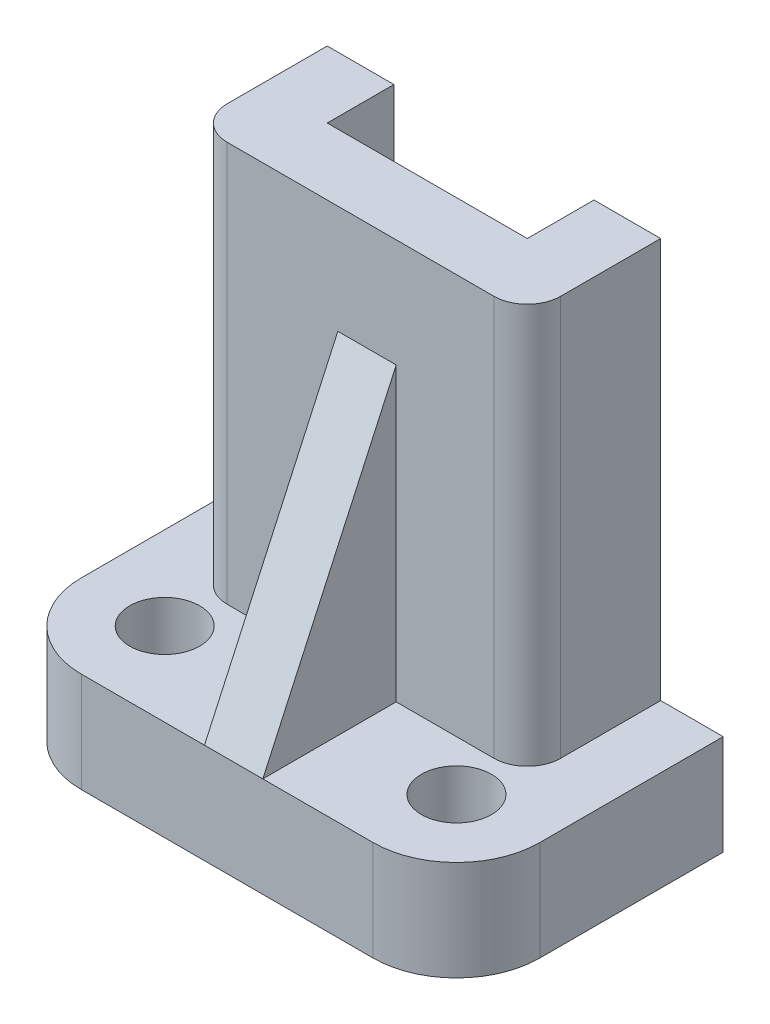
ISO-10303-21;
HEADER;
FILE_DESCRIPTION(('STEP AP214'),'2;1');
FILE_NAME('part.step','',(''),(''),'','','');
FILE_SCHEMA(('AUTOMOTIVE_DESIGN { 1 0 10303 214 1 1 1 1 }'));
ENDSEC;
DATA;
#1=APPLICATION_CONTEXT('core data for automotive mechanical design processes');
#2=APPLICATION_PROTOCOL_DEFINITION('international standard','automotive_design',2000,#1);
#3=PRODUCT_CONTEXT('',#1,'mechanical');
#4=PRODUCT('Part','Part','',(#3));
#5=PRODUCT_RELATED_PRODUCT_CATEGORY('part','',(#4));
#6=PRODUCT_DEFINITION_FORMATION('','',#4);
#7=PRODUCT_DEFINITION_CONTEXT('part definition',#1,'design');
#8=PRODUCT_DEFINITION('design','',#6,#7);
#9=PRODUCT_DEFINITION_SHAPE('','',#8);
#10=(LENGTH_UNIT() NAMED_UNIT(*) SI_UNIT(.MILLI.,.METRE.));
#11=(NAMED_UNIT(*) PLANE_ANGLE_UNIT() SI_UNIT($,.RADIAN.));
#12=(NAMED_UNIT(*) SI_UNIT($,.STERADIAN.) SOLID_ANGLE_UNIT());
#13=UNCERTAINTY_MEASURE_WITH_UNIT(LENGTH_MEASURE(1.E-05),#10,'distance_accuracy_value','');
#14=(GEOMETRIC_REPRESENTATION_CONTEXT(3) GLOBAL_UNCERTAINTY_ASSIGNED_CONTEXT((#13)) GLOBAL_UNIT_ASSIGNED_CONTEXT((#10,
#11,#12)) REPRESENTATION_CONTEXT('',''));
#15=CARTESIAN_POINT('',(0.,0.,0.));
#16=DIRECTION('',(0.,0.,1.));
#17=DIRECTION('',(1.,0.,0.));
#18=AXIS2_PLACEMENT_3D('',#15,#16,#17);
#19=CARTESIAN_POINT('',(0.,0.,16.));
#20=DIRECTION('',(0.,0.,1.));
#21=DIRECTION('',(1.,0.,0.));
#22=AXIS2_PLACEMENT_3D('',#19,#20,#21);
#23=PLANE('',#22);
#24=DIRECTION('',(0.,-1.,0.));
#25=VECTOR('',#24,1.);
#26=CARTESIAN_POINT('',(-22.7276368491322,35.,16.));
#27=LINE('',#26,#25);
#28=CARTESIAN_POINT('',(-22.7276368491322,35.,16.));
#29=VERTEX_POINT('',#28);
#30=CARTESIAN_POINT('',(-22.7276368491322,0.,16.));
#31=VERTEX_POINT('',#30);
#32=EDGE_CURVE('E421',#29,#31,#27,.T.);
#33=ORIENTED_EDGE('',*,*,#32,.F.);
#34=DIRECTION('',(-1.,0.,0.));
#35=VECTOR('',#34,1.);
#36=CARTESIAN_POINT('',(-15.7276368491322,35.,16.));
#37=LINE('',#36,#35);
#38=CARTESIAN_POINT('',(-15.7276368491322,35.,16.));
#39=VERTEX_POINT('',#38);
#40=EDGE_CURVE('E201',#39,#29,#37,.T.);
#41=ORIENTED_EDGE('',*,*,#40,.F.);
#42=DIRECTION('',(0.,1.,0.));
#43=VECTOR('',#42,1.);
#44=CARTESIAN_POINT('',(-15.7276368491322,35.,16.));
#45=LINE('',#44,#43);
#46=CARTESIAN_POINT('',(-15.7276368491322,0.,16.));
#47=VERTEX_POINT('',#46);
#48=EDGE_CURVE('E190',#47,#39,#45,.T.);
#49=ORIENTED_EDGE('',*,*,#48,.F.);
#50=DIRECTION('',(1.,0.,0.));
#51=VECTOR('',#50,1.);
#52=CARTESIAN_POINT('',(0.,0.,16.));
#53=LINE('',#52,#51);
#54=CARTESIAN_POINT('',(-4.,0.,16.));
#55=VERTEX_POINT('',#54);
#56=EDGE_CURVE('E199',#47,#55,#53,.T.);
#57=ORIENTED_EDGE('',*,*,#56,.T.);
#58=DIRECTION('',(0.,1.,0.));
#59=VECTOR('',#58,1.);
#60=CARTESIAN_POINT('',(-4.,48.,16.));
#61=LINE('',#60,#59);
#62=CARTESIAN_POINT('',(-4.,48.,16.));
#63=VERTEX_POINT('',#62);
#64=EDGE_CURVE('E272',#55,#63,#61,.T.);
#65=ORIENTED_EDGE('',*,*,#64,.T.);
#66=DIRECTION('',(-1.,0.,0.));
#67=VECTOR('',#66,1.);
#68=CARTESIAN_POINT('',(0.,48.,16.));
#69=LINE('',#68,#67);
#70=CARTESIAN_POINT('',(-36.,48.,16.));
#71=VERTEX_POINT('',#70);
#72=EDGE_CURVE('E248',#63,#71,#69,.T.);
#73=ORIENTED_EDGE('',*,*,#72,.T.);
#74=DIRECTION('',(0.,-1.,0.));
#75=VECTOR('',#74,1.);
#76=CARTESIAN_POINT('',(-36.,0.,16.));
#77=LINE('',#76,#75);
#78=CARTESIAN_POINT('',(-36.,0.,16.));
#79=VERTEX_POINT('',#78);
#80=EDGE_CURVE('E275',#71,#79,#77,.T.);
#81=ORIENTED_EDGE('',*,*,#80,.T.);
#82=EDGE_CURVE('E252',#79,#31,#53,.T.);
#83=ORIENTED_EDGE('',*,*,#82,.T.);
#84=EDGE_LOOP('',(#33,#41,#49,#57,#65,#73,#81,#83));
#85=FACE_BOUND('',#84,.T.);
#86=ADVANCED_FACE('F39',(#85),#23,.T.);
#87=CARTESIAN_POINT('',(0.,0.,0.));
#88=DIRECTION('',(0.,-1.,0.));
#89=DIRECTION('',(1.,0.,0.));
#90=AXIS2_PLACEMENT_3D('',#87,#88,#89);
#91=PLANE('',#90);
#92=CARTESIAN_POINT('',(-37.5,0.,22.));
#93=DIRECTION('',(0.,-1.,0.));
#94=DIRECTION('',(1.,0.,0.));
#95=AXIS2_PLACEMENT_3D('',#92,#93,#94);
#96=CIRCLE('',#95,4.2);
#97=CARTESIAN_POINT('',(-33.3,0.,22.));
#98=VERTEX_POINT('',#97);
#99=EDGE_CURVE('E43',#98,#98,#96,.T.);
#100=ORIENTED_EDGE('',*,*,#99,.T.);
#101=EDGE_LOOP('',(#100));
#102=FACE_BOUND('',#101,.T.);
#103=DIRECTION('',(0.,0.,-1.));
#104=VECTOR('',#103,1.);
#105=CARTESIAN_POINT('',(-22.7276368491322,0.,32.));
#106=LINE('',#105,#104);
#107=CARTESIAN_POINT('',(-22.7276368491322,0.,32.));
#108=VERTEX_POINT('',#107);
#109=EDGE_CURVE('E200',#108,#31,#106,.T.);
#110=ORIENTED_EDGE('',*,*,#109,.T.);
#111=ORIENTED_EDGE('',*,*,#82,.F.);
#112=CARTESIAN_POINT('',(-36.,0.,12.));
#113=DIRECTION('',(0.,1.,0.));
#114=DIRECTION('',(-1.,0.,0.));
#115=AXIS2_PLACEMENT_3D('',#112,#113,#114);
#116=CIRCLE('',#115,4.);
#117=CARTESIAN_POINT('',(-40.,0.,12.));
#118=VERTEX_POINT('',#117);
#119=EDGE_CURVE('E280',#79,#118,#116,.F.);
#120=ORIENTED_EDGE('',*,*,#119,.T.);
#121=DIRECTION('',(0.,0.,-1.));
#122=VECTOR('',#121,1.);
#123=CARTESIAN_POINT('',(-40.,0.,16.));
#124=LINE('',#123,#122);
#125=CARTESIAN_POINT('',(-40.,0.,0.));
#126=VERTEX_POINT('',#125);
#127=EDGE_CURVE('E264',#118,#126,#124,.T.);
#128=ORIENTED_EDGE('',*,*,#127,.T.);
#129=DIRECTION('',(1.,0.,0.));
#130=VECTOR('',#129,1.);
#131=CARTESIAN_POINT('',(7.5,0.,0.));
#132=LINE('',#131,#130);
#133=CARTESIAN_POINT('',(-47.5,0.,0.));
#134=VERTEX_POINT('',#133);
#135=EDGE_CURVE('E217',#134,#126,#132,.T.);
#136=ORIENTED_EDGE('',*,*,#135,.F.);
#137=DIRECTION('',(0.,0.,-1.));
#138=VECTOR('',#137,1.);
#139=CARTESIAN_POINT('',(-47.5,0.,0.));
#140=LINE('',#139,#138);
#141=CARTESIAN_POINT('',(-47.5,0.,22.));
#142=VERTEX_POINT('',#141);
#143=EDGE_CURVE('E208',#142,#134,#140,.T.);
#144=ORIENTED_EDGE('',*,*,#143,.F.);
#145=CARTESIAN_POINT('',(-37.5,0.,22.));
#146=DIRECTION('',(0.,-1.,0.));
#147=DIRECTION('',(1.,0.,0.));
#148=AXIS2_PLACEMENT_3D('',#145,#146,#147);
#149=CIRCLE('',#148,10.);
#150=CARTESIAN_POINT('',(-37.5,0.,32.));
#151=VERTEX_POINT('',#150);
#152=EDGE_CURVE('E303',#142,#151,#149,.F.);
#153=ORIENTED_EDGE('',*,*,#152,.T.);
#154=DIRECTION('',(-1.,0.,0.));
#155=VECTOR('',#154,1.);
#156=CARTESIAN_POINT('',(7.5,0.,32.));
#157=LINE('',#156,#155);
#158=EDGE_CURVE('E209',#108,#151,#157,.T.);
#159=ORIENTED_EDGE('',*,*,#158,.F.);
#160=EDGE_LOOP('',(#110,#111,#120,#128,#136,#144,#153,#159));
#161=FACE_BOUND('',#160,.T.);
#162=ADVANCED_FACE('F353',(#102,#161),#91,.F.);
#163=CARTESIAN_POINT('',(-2.5,0.,22.));
#164=DIRECTION('',(0.,-1.,0.));
#165=DIRECTION('',(1.,0.,0.));
#166=AXIS2_PLACEMENT_3D('',#163,#164,#165);
#167=CIRCLE('',#166,4.2);
#168=CARTESIAN_POINT('',(1.7,0.,22.));
#169=VERTEX_POINT('',#168);
#170=EDGE_CURVE('E310',#169,#169,#167,.T.);
#171=ORIENTED_EDGE('',*,*,#170,.T.);
#172=EDGE_LOOP('',(#171));
#173=FACE_BOUND('',#172,.T.);
#174=DIRECTION('',(0.,0.,-1.));
#175=VECTOR('',#174,1.);
#176=CARTESIAN_POINT('',(-15.7276368491322,0.,32.));
#177=LINE('',#176,#175);
#178=CARTESIAN_POINT('',(-15.7276368491322,0.,32.));
#179=VERTEX_POINT('',#178);
#180=EDGE_CURVE('E188',#179,#47,#177,.T.);
#181=ORIENTED_EDGE('',*,*,#180,.F.);
#182=CARTESIAN_POINT('',(-2.5,0.,32.));
#183=VERTEX_POINT('',#182);
#184=EDGE_CURVE('E197',#183,#179,#157,.T.);
#185=ORIENTED_EDGE('',*,*,#184,.F.);
#186=CARTESIAN_POINT('',(-2.5,0.,22.));
#187=DIRECTION('',(0.,-1.,0.));
#188=DIRECTION('',(1.,0.,0.));
#189=AXIS2_PLACEMENT_3D('',#186,#187,#188);
#190=CIRCLE('',#189,10.);
#191=CARTESIAN_POINT('',(7.5,0.,22.));
#192=VERTEX_POINT('',#191);
#193=EDGE_CURVE('E306',#183,#192,#190,.F.);
#194=ORIENTED_EDGE('',*,*,#193,.T.);
#195=DIRECTION('',(0.,0.,1.));
#196=VECTOR('',#195,1.);
#197=CARTESIAN_POINT('',(7.5,0.,0.));
#198=LINE('',#197,#196);
#199=CARTESIAN_POINT('',(7.5,0.,0.));
#200=VERTEX_POINT('',#199);
#201=EDGE_CURVE('E213',#200,#192,#198,.T.);
#202=ORIENTED_EDGE('',*,*,#201,.F.);
#203=CARTESIAN_POINT('',(0.,0.,0.));
#204=VERTEX_POINT('',#203);
#205=EDGE_CURVE('E211',#204,#200,#132,.T.);
#206=ORIENTED_EDGE('',*,*,#205,.F.);
#207=DIRECTION('',(0.,0.,-1.));
#208=VECTOR('',#207,1.);
#209=CARTESIAN_POINT('',(0.,0.,16.));
#210=LINE('',#209,#208);
#211=CARTESIAN_POINT('',(0.,0.,12.));
#212=VERTEX_POINT('',#211);
#213=EDGE_CURVE('E255',#212,#204,#210,.T.);
#214=ORIENTED_EDGE('',*,*,#213,.F.);
#215=CARTESIAN_POINT('',(-4.,0.,12.));
#216=DIRECTION('',(0.,1.,0.));
#217=DIRECTION('',(-1.,0.,0.));
#218=AXIS2_PLACEMENT_3D('',#215,#216,#217);
#219=CIRCLE('',#218,4.);
#220=EDGE_CURVE('E278',#212,#55,#219,.F.);
#221=ORIENTED_EDGE('',*,*,#220,.T.);
#222=ORIENTED_EDGE('',*,*,#56,.F.);
#223=EDGE_LOOP('',(#181,#185,#194,#202,#206,#214,#221,#222));
#224=FACE_BOUND('',#223,.T.);
#225=ADVANCED_FACE('F196',(#173,#224),#91,.F.);
#226=CARTESIAN_POINT('',(0.,0.,16.));
#227=DIRECTION('',(-1.,0.,0.));
#228=DIRECTION('',(0.,0.,1.));
#229=AXIS2_PLACEMENT_3D('',#226,#227,#228);
#230=PLANE('',#229);
#231=DIRECTION('',(0.,0.,-1.));
#232=VECTOR('',#231,1.);
#233=CARTESIAN_POINT('',(0.,48.,16.));
#234=LINE('',#233,#232);
#235=CARTESIAN_POINT('',(0.,48.,12.));
#236=VERTEX_POINT('',#235);
#237=CARTESIAN_POINT('',(0.,48.,0.));
#238=VERTEX_POINT('',#237);
#239=EDGE_CURVE('E270',#236,#238,#234,.T.);
#240=ORIENTED_EDGE('',*,*,#239,.F.);
#241=DIRECTION('',(0.,1.,0.));
#242=VECTOR('',#241,1.);
#243=CARTESIAN_POINT('',(0.,0.,12.));
#244=LINE('',#243,#242);
#245=EDGE_CURVE('E289',#236,#212,#244,.F.);
#246=ORIENTED_EDGE('',*,*,#245,.T.);
#247=ORIENTED_EDGE('',*,*,#213,.T.);
#248=DIRECTION('',(0.,1.,0.));
#249=VECTOR('',#248,1.);
#250=CARTESIAN_POINT('',(0.,0.,0.));
#251=LINE('',#250,#249);
#252=EDGE_CURVE('E247',#204,#238,#251,.T.);
#253=ORIENTED_EDGE('',*,*,#252,.T.);
#254=EDGE_LOOP('',(#240,#246,#247,#253));
#255=FACE_BOUND('',#254,.T.);
#256=ADVANCED_FACE('F378',(#255),#230,.F.);
#257=CARTESIAN_POINT('',(0.,48.,16.));
#258=DIRECTION('',(0.,-1.,0.));
#259=DIRECTION('',(1.,0.,0.));
#260=AXIS2_PLACEMENT_3D('',#257,#258,#259);
#261=PLANE('',#260);
#262=DIRECTION('',(1.,0.,0.));
#263=VECTOR('',#262,1.);
#264=CARTESIAN_POINT('',(-8.00000000000001,48.,8.));
#265=LINE('',#264,#263);
#266=CARTESIAN_POINT('',(-32.,48.,8.));
#267=VERTEX_POINT('',#266);
#268=CARTESIAN_POINT('',(-8.00000000000001,48.,8.));
#269=VERTEX_POINT('',#268);
#270=EDGE_CURVE('E232',#267,#269,#265,.T.);
#271=ORIENTED_EDGE('',*,*,#270,.F.);
#272=DIRECTION('',(0.,0.,1.));
#273=VECTOR('',#272,1.);
#274=CARTESIAN_POINT('',(-32.,48.,8.));
#275=LINE('',#274,#273);
#276=CARTESIAN_POINT('',(-32.,48.,0.));
#277=VERTEX_POINT('',#276);
#278=EDGE_CURVE('E229',#277,#267,#275,.T.);
#279=ORIENTED_EDGE('',*,*,#278,.F.);
#280=DIRECTION('',(-1.,0.,0.));
#281=VECTOR('',#280,1.);
#282=CARTESIAN_POINT('',(0.,48.,0.));
#283=LINE('',#282,#281);
#284=CARTESIAN_POINT('',(-40.,48.,0.));
#285=VERTEX_POINT('',#284);
#286=EDGE_CURVE('E258',#277,#285,#283,.T.);
#287=ORIENTED_EDGE('',*,*,#286,.T.);
#288=DIRECTION('',(0.,0.,-1.));
#289=VECTOR('',#288,1.);
#290=CARTESIAN_POINT('',(-40.,48.,16.));
#291=LINE('',#290,#289);
#292=CARTESIAN_POINT('',(-40.,48.,12.));
#293=VERTEX_POINT('',#292);
#294=EDGE_CURVE('E267',#293,#285,#291,.T.);
#295=ORIENTED_EDGE('',*,*,#294,.F.);
#296=CARTESIAN_POINT('',(-36.,48.,12.));
#297=DIRECTION('',(0.,-1.,0.));
#298=DIRECTION('',(1.,0.,0.));
#299=AXIS2_PLACEMENT_3D('',#296,#297,#298);
#300=CIRCLE('',#299,4.);
#301=EDGE_CURVE('E287',#293,#71,#300,.F.);
#302=ORIENTED_EDGE('',*,*,#301,.T.);
#303=ORIENTED_EDGE('',*,*,#72,.F.);
#304=CARTESIAN_POINT('',(-4.,48.,12.));
#305=DIRECTION('',(0.,-1.,0.));
#306=DIRECTION('',(1.,0.,0.));
#307=AXIS2_PLACEMENT_3D('',#304,#305,#306);
#308=CIRCLE('',#307,4.);
#309=EDGE_CURVE('E285',#63,#236,#308,.F.);
#310=ORIENTED_EDGE('',*,*,#309,.T.);
#311=ORIENTED_EDGE('',*,*,#239,.T.);
#312=CARTESIAN_POINT('',(-8.00000000000001,48.,0.));
#313=VERTEX_POINT('',#312);
#314=EDGE_CURVE('E259',#238,#313,#283,.T.);
#315=ORIENTED_EDGE('',*,*,#314,.T.);
#316=DIRECTION('',(0.,0.,-1.));
#317=VECTOR('',#316,1.);
#318=CARTESIAN_POINT('',(-8.00000000000001,48.,8.));
#319=LINE('',#318,#317);
#320=EDGE_CURVE('E235',#269,#313,#319,.T.);
#321=ORIENTED_EDGE('',*,*,#320,.F.);
#322=EDGE_LOOP('',(#271,#279,#287,#295,#302,#303,#310,#311,#315,#321));
#323=FACE_BOUND('',#322,.T.);
#324=ADVANCED_FACE('F374',(#323),#261,.F.);
#325=CARTESIAN_POINT('',(-40.,0.,16.));
#326=DIRECTION('',(1.,0.,0.));
#327=DIRECTION('',(0.,1.,0.));
#328=AXIS2_PLACEMENT_3D('',#325,#326,#327);
#329=PLANE('',#328);
#330=ORIENTED_EDGE('',*,*,#127,.F.);
#331=DIRECTION('',(0.,-1.,0.));
#332=VECTOR('',#331,1.);
#333=CARTESIAN_POINT('',(-40.,48.,12.));
#334=LINE('',#333,#332);
#335=EDGE_CURVE('E283',#118,#293,#334,.F.);
#336=ORIENTED_EDGE('',*,*,#335,.T.);
#337=ORIENTED_EDGE('',*,*,#294,.T.);
#338=DIRECTION('',(0.,-1.,0.));
#339=VECTOR('',#338,1.);
#340=CARTESIAN_POINT('',(-40.,0.,0.));
#341=LINE('',#340,#339);
#342=EDGE_CURVE('E251',#285,#126,#341,.T.);
#343=ORIENTED_EDGE('',*,*,#342,.T.);
#344=EDGE_LOOP('',(#330,#336,#337,#343));
#345=FACE_BOUND('',#344,.T.);
#346=ADVANCED_FACE('F371',(#345),#329,.F.);
#347=CARTESIAN_POINT('',(0.,0.,0.));
#348=DIRECTION('',(0.,0.,1.));
#349=DIRECTION('',(1.,0.,0.));
#350=AXIS2_PLACEMENT_3D('',#347,#348,#349);
#351=PLANE('',#350);
#352=ORIENTED_EDGE('',*,*,#252,.F.);
#353=ORIENTED_EDGE('',*,*,#205,.T.);
#354=DIRECTION('',(0.,1.,0.));
#355=VECTOR('',#354,1.);
#356=CARTESIAN_POINT('',(7.5,-12.,0.));
#357=LINE('',#356,#355);
#358=CARTESIAN_POINT('',(7.5,-12.,0.));
#359=VERTEX_POINT('',#358);
#360=EDGE_CURVE('E222',#359,#200,#357,.T.);
#361=ORIENTED_EDGE('',*,*,#360,.F.);
#362=DIRECTION('',(1.,0.,0.));
#363=VECTOR('',#362,1.);
#364=CARTESIAN_POINT('',(7.5,-12.,0.));
#365=LINE('',#364,#363);
#366=CARTESIAN_POINT('',(-47.5,-12.,0.));
#367=VERTEX_POINT('',#366);
#368=EDGE_CURVE('E226',#367,#359,#365,.T.);
#369=ORIENTED_EDGE('',*,*,#368,.F.);
#370=DIRECTION('',(0.,1.,0.));
#371=VECTOR('',#370,1.);
#372=CARTESIAN_POINT('',(-47.5,-12.,0.));
#373=LINE('',#372,#371);
#374=EDGE_CURVE('E225',#367,#134,#373,.T.);
#375=ORIENTED_EDGE('',*,*,#374,.T.);
#376=ORIENTED_EDGE('',*,*,#135,.T.);
#377=ORIENTED_EDGE('',*,*,#342,.F.);
#378=ORIENTED_EDGE('',*,*,#286,.F.);
#379=DIRECTION('',(0.,-1.,0.));
#380=VECTOR('',#379,1.);
#381=CARTESIAN_POINT('',(-32.,0.,0.));
#382=LINE('',#381,#380);
#383=CARTESIAN_POINT('',(-32.,0.,0.));
#384=VERTEX_POINT('',#383);
#385=EDGE_CURVE('E294',#277,#384,#382,.T.);
#386=ORIENTED_EDGE('',*,*,#385,.T.);
#387=CARTESIAN_POINT('',(-8.,0.,0.));
#388=VERTEX_POINT('',#387);
#389=EDGE_CURVE('E221',#384,#388,#132,.T.);
#390=ORIENTED_EDGE('',*,*,#389,.T.);
#391=DIRECTION('',(0.,1.,0.));
#392=VECTOR('',#391,1.);
#393=CARTESIAN_POINT('',(-8.,0.,0.));
#394=LINE('',#393,#392);
#395=EDGE_CURVE('E291',#388,#313,#394,.T.);
#396=ORIENTED_EDGE('',*,*,#395,.T.);
#397=ORIENTED_EDGE('',*,*,#314,.F.);
#398=EDGE_LOOP('',(#352,#353,#361,#369,#375,#376,#377,#378,#386,#390,#396,#397));
#399=FACE_BOUND('',#398,.T.);
#400=ADVANCED_FACE('F336',(#399),#351,.F.);
#401=CARTESIAN_POINT('',(-36.,0.,12.));
#402=DIRECTION('',(0.,1.,0.));
#403=DIRECTION('',(-1.,0.,0.));
#404=AXIS2_PLACEMENT_3D('',#401,#402,#403);
#405=CYLINDRICAL_SURFACE('',#404,4.);
#406=ORIENTED_EDGE('',*,*,#301,.F.);
#407=ORIENTED_EDGE('',*,*,#335,.F.);
#408=ORIENTED_EDGE('',*,*,#119,.F.);
#409=ORIENTED_EDGE('',*,*,#80,.F.);
#410=EDGE_LOOP('',(#406,#407,#408,#409));
#411=FACE_BOUND('',#410,.T.);
#412=ADVANCED_FACE('F370',(#411),#405,.T.);
#413=CARTESIAN_POINT('',(-4.,0.,12.));
#414=DIRECTION('',(0.,-1.,0.));
#415=DIRECTION('',(0.,0.,-1.));
#416=AXIS2_PLACEMENT_3D('',#413,#414,#415);
#417=CYLINDRICAL_SURFACE('',#416,4.);
#418=ORIENTED_EDGE('',*,*,#220,.F.);
#419=ORIENTED_EDGE('',*,*,#245,.F.);
#420=ORIENTED_EDGE('',*,*,#309,.F.);
#421=ORIENTED_EDGE('',*,*,#64,.F.);
#422=EDGE_LOOP('',(#418,#419,#420,#421));
#423=FACE_BOUND('',#422,.T.);
#424=ADVANCED_FACE('F385',(#423),#417,.T.);
#425=CARTESIAN_POINT('',(-7.99999999999999,-11.,8.));
#426=DIRECTION('',(0.,0.,1.));
#427=DIRECTION('',(1.,0.,0.));
#428=AXIS2_PLACEMENT_3D('',#425,#426,#427);
#429=PLANE('',#428);
#430=DIRECTION('',(0.,1.,0.));
#431=VECTOR('',#430,1.);
#432=CARTESIAN_POINT('',(-32.,-11.,8.));
#433=LINE('',#432,#431);
#434=CARTESIAN_POINT('',(-32.,0.,8.));
#435=VERTEX_POINT('',#434);
#436=EDGE_CURVE('E237',#435,#267,#433,.T.);
#437=ORIENTED_EDGE('',*,*,#436,.T.);
#438=ORIENTED_EDGE('',*,*,#270,.T.);
#439=DIRECTION('',(0.,1.,0.));
#440=VECTOR('',#439,1.);
#441=CARTESIAN_POINT('',(-7.99999999999999,-11.,8.));
#442=LINE('',#441,#440);
#443=CARTESIAN_POINT('',(-8.,0.,8.));
#444=VERTEX_POINT('',#443);
#445=EDGE_CURVE('E238',#444,#269,#442,.T.);
#446=ORIENTED_EDGE('',*,*,#445,.F.);
#447=DIRECTION('',(1.,0.,0.));
#448=VECTOR('',#447,1.);
#449=CARTESIAN_POINT('',(0.,0.,8.));
#450=LINE('',#449,#448);
#451=EDGE_CURVE('E297',#435,#444,#450,.T.);
#452=ORIENTED_EDGE('',*,*,#451,.F.);
#453=EDGE_LOOP('',(#437,#438,#446,#452));
#454=FACE_BOUND('',#453,.T.);
#455=ADVANCED_FACE('F388',(#454),#429,.F.);
#456=CARTESIAN_POINT('',(-32.,-11.,8.));
#457=DIRECTION('',(-1.,0.,0.));
#458=DIRECTION('',(0.,-1.,0.));
#459=AXIS2_PLACEMENT_3D('',#456,#457,#458);
#460=PLANE('',#459);
#461=ORIENTED_EDGE('',*,*,#385,.F.);
#462=ORIENTED_EDGE('',*,*,#278,.T.);
#463=ORIENTED_EDGE('',*,*,#436,.F.);
#464=DIRECTION('',(0.,0.,1.));
#465=VECTOR('',#464,1.);
#466=CARTESIAN_POINT('',(-32.,0.,16.));
#467=LINE('',#466,#465);
#468=EDGE_CURVE('E244',#384,#435,#467,.T.);
#469=ORIENTED_EDGE('',*,*,#468,.F.);
#470=EDGE_LOOP('',(#461,#462,#463,#469));
#471=FACE_BOUND('',#470,.T.);
#472=ADVANCED_FACE('F366',(#471),#460,.F.);
#473=CARTESIAN_POINT('',(-7.99999999999999,-11.,8.));
#474=DIRECTION('',(1.,0.,0.));
#475=DIRECTION('',(0.,1.,0.));
#476=AXIS2_PLACEMENT_3D('',#473,#474,#475);
#477=PLANE('',#476);
#478=ORIENTED_EDGE('',*,*,#445,.T.);
#479=ORIENTED_EDGE('',*,*,#320,.T.);
#480=ORIENTED_EDGE('',*,*,#395,.F.);
#481=DIRECTION('',(0.,0.,-1.));
#482=VECTOR('',#481,1.);
#483=CARTESIAN_POINT('',(-8.,0.,16.));
#484=LINE('',#483,#482);
#485=EDGE_CURVE('E240',#444,#388,#484,.T.);
#486=ORIENTED_EDGE('',*,*,#485,.F.);
#487=EDGE_LOOP('',(#478,#479,#480,#486));
#488=FACE_BOUND('',#487,.T.);
#489=ADVANCED_FACE('F350',(#488),#477,.F.);
#490=ORIENTED_EDGE('',*,*,#389,.F.);
#491=ORIENTED_EDGE('',*,*,#468,.T.);
#492=ORIENTED_EDGE('',*,*,#451,.T.);
#493=ORIENTED_EDGE('',*,*,#485,.T.);
#494=EDGE_LOOP('',(#490,#491,#492,#493));
#495=FACE_BOUND('',#494,.T.);
#496=ADVANCED_FACE('F341',(#495),#91,.F.);
#497=CARTESIAN_POINT('',(7.5,-12.,0.));
#498=DIRECTION('',(-1.,0.,0.));
#499=DIRECTION('',(0.,-1.,0.));
#500=AXIS2_PLACEMENT_3D('',#497,#498,#499);
#501=PLANE('',#500);
#502=ORIENTED_EDGE('',*,*,#201,.T.);
#503=DIRECTION('',(0.,1.,0.));
#504=VECTOR('',#503,1.);
#505=CARTESIAN_POINT('',(7.5,-12.,22.));
#506=LINE('',#505,#504);
#507=CARTESIAN_POINT('',(7.5,-12.,22.));
#508=VERTEX_POINT('',#507);
#509=EDGE_CURVE('E64',#192,#508,#506,.F.);
#510=ORIENTED_EDGE('',*,*,#509,.T.);
#511=DIRECTION('',(0.,0.,1.));
#512=VECTOR('',#511,1.);
#513=CARTESIAN_POINT('',(7.5,-12.,0.));
#514=LINE('',#513,#512);
#515=EDGE_CURVE('E220',#359,#508,#514,.T.);
#516=ORIENTED_EDGE('',*,*,#515,.F.);
#517=ORIENTED_EDGE('',*,*,#360,.T.);
#518=EDGE_LOOP('',(#502,#510,#516,#517));
#519=FACE_BOUND('',#518,.T.);
#520=ADVANCED_FACE('F339',(#519),#501,.F.);
#521=CARTESIAN_POINT('',(7.5,-12.,32.));
#522=DIRECTION('',(0.,0.,-1.));
#523=DIRECTION('',(-1.,0.,0.));
#524=AXIS2_PLACEMENT_3D('',#521,#522,#523);
#525=PLANE('',#524);
#526=ORIENTED_EDGE('',*,*,#184,.T.);
#527=DIRECTION('',(1.,0.,0.));
#528=VECTOR('',#527,1.);
#529=CARTESIAN_POINT('',(-31.7276368491322,0.,32.));
#530=LINE('',#529,#528);
#531=EDGE_CURVE('E174',#108,#179,#530,.T.);
#532=ORIENTED_EDGE('',*,*,#531,.F.);
#533=ORIENTED_EDGE('',*,*,#158,.T.);
#534=DIRECTION('',(0.,1.,0.));
#535=VECTOR('',#534,1.);
#536=CARTESIAN_POINT('',(-37.5,-12.,32.));
#537=LINE('',#536,#535);
#538=CARTESIAN_POINT('',(-37.5,-12.,32.));
#539=VERTEX_POINT('',#538);
#540=EDGE_CURVE('E300',#151,#539,#537,.F.);
#541=ORIENTED_EDGE('',*,*,#540,.T.);
#542=DIRECTION('',(-1.,0.,0.));
#543=VECTOR('',#542,1.);
#544=CARTESIAN_POINT('',(7.5,-12.,32.));
#545=LINE('',#544,#543);
#546=CARTESIAN_POINT('',(-2.5,-12.,32.));
#547=VERTEX_POINT('',#546);
#548=EDGE_CURVE('E326',#547,#539,#545,.T.);
#549=ORIENTED_EDGE('',*,*,#548,.F.);
#550=DIRECTION('',(0.,1.,0.));
#551=VECTOR('',#550,1.);
#552=CARTESIAN_POINT('',(-2.5,-12.,32.));
#553=LINE('',#552,#551);
#554=EDGE_CURVE('E207',#547,#183,#553,.T.);
#555=ORIENTED_EDGE('',*,*,#554,.T.);
#556=EDGE_LOOP('',(#526,#532,#533,#541,#549,#555));
#557=FACE_BOUND('',#556,.T.);
#558=ADVANCED_FACE('F204',(#557),#525,.F.);
#559=CARTESIAN_POINT('',(-47.5,-12.,0.));
#560=DIRECTION('',(1.,0.,0.));
#561=DIRECTION('',(0.,1.,0.));
#562=AXIS2_PLACEMENT_3D('',#559,#560,#561);
#563=PLANE('',#562);
#564=DIRECTION('',(0.,0.,-1.));
#565=VECTOR('',#564,1.);
#566=CARTESIAN_POINT('',(-47.5,-12.,0.));
#567=LINE('',#566,#565);
#568=CARTESIAN_POINT('',(-47.5,-12.,22.));
#569=VERTEX_POINT('',#568);
#570=EDGE_CURVE('E328',#569,#367,#567,.T.);
#571=ORIENTED_EDGE('',*,*,#570,.F.);
#572=DIRECTION('',(0.,1.,0.));
#573=VECTOR('',#572,1.);
#574=CARTESIAN_POINT('',(-47.5,-12.,22.));
#575=LINE('',#574,#573);
#576=EDGE_CURVE('E11',#569,#142,#575,.T.);
#577=ORIENTED_EDGE('',*,*,#576,.T.);
#578=ORIENTED_EDGE('',*,*,#143,.T.);
#579=ORIENTED_EDGE('',*,*,#374,.F.);
#580=EDGE_LOOP('',(#571,#577,#578,#579));
#581=FACE_BOUND('',#580,.T.);
#582=ADVANCED_FACE('F348',(#581),#563,.F.);
#583=CARTESIAN_POINT('',(0.,-12.,0.));
#584=DIRECTION('',(0.,-1.,0.));
#585=DIRECTION('',(1.,0.,0.));
#586=AXIS2_PLACEMENT_3D('',#583,#584,#585);
#587=PLANE('',#586);
#588=CARTESIAN_POINT('',(-37.5,-12.,22.));
#589=DIRECTION('',(0.,-1.,0.));
#590=DIRECTION('',(1.,0.,0.));
#591=AXIS2_PLACEMENT_3D('',#588,#589,#590);
#592=CIRCLE('',#591,4.2);
#593=CARTESIAN_POINT('',(-33.3,-12.,22.));
#594=VERTEX_POINT('',#593);
#595=EDGE_CURVE('E312',#594,#594,#592,.T.);
#596=ORIENTED_EDGE('',*,*,#595,.F.);
#597=EDGE_LOOP('',(#596));
#598=FACE_BOUND('',#597,.T.);
#599=CARTESIAN_POINT('',(-2.5,-12.,22.));
#600=DIRECTION('',(0.,-1.,0.));
#601=DIRECTION('',(1.,0.,0.));
#602=AXIS2_PLACEMENT_3D('',#599,#600,#601);
#603=CIRCLE('',#602,4.2);
#604=CARTESIAN_POINT('',(1.7,-12.,22.));
#605=VERTEX_POINT('',#604);
#606=EDGE_CURVE('E317',#605,#605,#603,.T.);
#607=ORIENTED_EDGE('',*,*,#606,.F.);
#608=EDGE_LOOP('',(#607));
#609=FACE_BOUND('',#608,.T.);
#610=ORIENTED_EDGE('',*,*,#515,.T.);
#611=CARTESIAN_POINT('',(-2.5,-12.,22.));
#612=DIRECTION('',(0.,-1.,0.));
#613=DIRECTION('',(1.,0.,0.));
#614=AXIS2_PLACEMENT_3D('',#611,#612,#613);
#615=CIRCLE('',#614,10.);
#616=EDGE_CURVE('E48',#508,#547,#615,.T.);
#617=ORIENTED_EDGE('',*,*,#616,.T.);
#618=ORIENTED_EDGE('',*,*,#548,.T.);
#619=CARTESIAN_POINT('',(-37.5,-12.,22.));
#620=DIRECTION('',(0.,-1.,0.));
#621=DIRECTION('',(1.,0.,0.));
#622=AXIS2_PLACEMENT_3D('',#619,#620,#621);
#623=CIRCLE('',#622,10.);
#624=EDGE_CURVE('E56',#539,#569,#623,.T.);
#625=ORIENTED_EDGE('',*,*,#624,.T.);
#626=ORIENTED_EDGE('',*,*,#570,.T.);
#627=ORIENTED_EDGE('',*,*,#368,.T.);
#628=EDGE_LOOP('',(#610,#617,#618,#625,#626,#627));
#629=FACE_BOUND('',#628,.T.);
#630=ADVANCED_FACE('F331',(#598,#609,#629),#587,.T.);
#631=CARTESIAN_POINT('',(-2.5,-12.,22.));
#632=DIRECTION('',(0.,1.,0.));
#633=DIRECTION('',(-1.,0.,0.));
#634=AXIS2_PLACEMENT_3D('',#631,#632,#633);
#635=CYLINDRICAL_SURFACE('',#634,10.);
#636=ORIENTED_EDGE('',*,*,#616,.F.);
#637=ORIENTED_EDGE('',*,*,#509,.F.);
#638=ORIENTED_EDGE('',*,*,#193,.F.);
#639=ORIENTED_EDGE('',*,*,#554,.F.);
#640=EDGE_LOOP('',(#636,#637,#638,#639));
#641=FACE_BOUND('',#640,.T.);
#642=ADVANCED_FACE('F390',(#641),#635,.T.);
#643=CARTESIAN_POINT('',(-37.5,-12.,22.));
#644=DIRECTION('',(0.,1.,0.));
#645=DIRECTION('',(-1.,0.,0.));
#646=AXIS2_PLACEMENT_3D('',#643,#644,#645);
#647=CYLINDRICAL_SURFACE('',#646,10.);
#648=ORIENTED_EDGE('',*,*,#624,.F.);
#649=ORIENTED_EDGE('',*,*,#540,.F.);
#650=ORIENTED_EDGE('',*,*,#152,.F.);
#651=ORIENTED_EDGE('',*,*,#576,.F.);
#652=EDGE_LOOP('',(#648,#649,#650,#651));
#653=FACE_BOUND('',#652,.T.);
#654=ADVANCED_FACE('F41',(#653),#647,.T.);
#655=CARTESIAN_POINT('',(-2.5,9.,22.));
#656=DIRECTION('',(0.,-1.,0.));
#657=DIRECTION('',(1.,0.,0.));
#658=AXIS2_PLACEMENT_3D('',#655,#656,#657);
#659=CYLINDRICAL_SURFACE('',#658,4.2);
#660=ORIENTED_EDGE('',*,*,#606,.T.);
#661=EDGE_LOOP('',(#660));
#662=FACE_BOUND('',#661,.T.);
#663=ORIENTED_EDGE('',*,*,#170,.F.);
#664=EDGE_LOOP('',(#663));
#665=FACE_BOUND('',#664,.T.);
#666=ADVANCED_FACE('F396',(#662,#665),#659,.F.);
#667=CARTESIAN_POINT('',(-37.5,8.99999999999999,22.));
#668=DIRECTION('',(0.,-1.,0.));
#669=DIRECTION('',(1.,0.,0.));
#670=AXIS2_PLACEMENT_3D('',#667,#668,#669);
#671=CYLINDRICAL_SURFACE('',#670,4.2);
#672=ORIENTED_EDGE('',*,*,#595,.T.);
#673=EDGE_LOOP('',(#672));
#674=FACE_BOUND('',#673,.T.);
#675=ORIENTED_EDGE('',*,*,#99,.F.);
#676=EDGE_LOOP('',(#675));
#677=FACE_BOUND('',#676,.T.);
#678=ADVANCED_FACE('F539',(#674,#677),#671,.F.);
#679=CARTESIAN_POINT('',(-22.7276368491322,35.,32.));
#680=DIRECTION('',(1.,0.,0.));
#681=DIRECTION('',(0.,1.,0.));
#682=AXIS2_PLACEMENT_3D('',#679,#680,#681);
#683=PLANE('',#682);
#684=ORIENTED_EDGE('',*,*,#109,.F.);
#685=DIRECTION('',(0.,0.9094744755858,-0.415759760267794));
#686=VECTOR('',#685,1.);
#687=CARTESIAN_POINT('',(-22.7276368491322,28.9500337609723,18.7656988521269));
#688=LINE('',#687,#686);
#689=EDGE_CURVE('E180',#108,#29,#688,.T.);
#690=ORIENTED_EDGE('',*,*,#689,.T.);
#691=ORIENTED_EDGE('',*,*,#32,.T.);
#692=EDGE_LOOP('',(#684,#690,#691));
#693=FACE_BOUND('',#692,.T.);
#694=ADVANCED_FACE('F420',(#693),#683,.F.);
#695=CARTESIAN_POINT('',(-15.7276368491322,35.,32.));
#696=DIRECTION('',(-1.,0.,0.));
#697=DIRECTION('',(0.,-1.,0.));
#698=AXIS2_PLACEMENT_3D('',#695,#696,#697);
#699=PLANE('',#698);
#700=ORIENTED_EDGE('',*,*,#48,.T.);
#701=DIRECTION('',(0.,0.9094744755858,-0.415759760267794));
#702=VECTOR('',#701,1.);
#703=CARTESIAN_POINT('',(-15.7276368491322,35.,16.));
#704=LINE('',#703,#702);
#705=EDGE_CURVE('E177',#179,#39,#704,.T.);
#706=ORIENTED_EDGE('',*,*,#705,.F.);
#707=ORIENTED_EDGE('',*,*,#180,.T.);
#708=EDGE_LOOP('',(#700,#706,#707));
#709=FACE_BOUND('',#708,.T.);
#710=ADVANCED_FACE('F187',(#709),#699,.F.);
#711=CARTESIAN_POINT('',(-31.7276368491322,35.,16.));
#712=DIRECTION('',(0.,-0.415759760267794,-0.9094744755858));
#713=DIRECTION('',(0.,0.9094744755858,-0.415759760267794));
#714=AXIS2_PLACEMENT_3D('',#711,#712,#713);
#715=PLANE('',#714);
#716=ORIENTED_EDGE('',*,*,#531,.T.);
#717=ORIENTED_EDGE('',*,*,#705,.T.);
#718=ORIENTED_EDGE('',*,*,#40,.T.);
#719=ORIENTED_EDGE('',*,*,#689,.F.);
#720=EDGE_LOOP('',(#716,#717,#718,#719));
#721=FACE_BOUND('',#720,.T.);
#722=ADVANCED_FACE('F176',(#721),#715,.F.);
#723=CLOSED_SHELL('',(#86,#162,#225,#256,#324,#346,#400,#412,#424,#455,#472,#489,#496,#520,#558,
#582,#630,#642,#654,#666,#678,#694,#710,#722));
#724=MANIFOLD_SOLID_BREP('B2',#723);
#725=ADVANCED_BREP_SHAPE_REPRESENTATION('',(#18,#724),#14);
#726=SHAPE_DEFINITION_REPRESENTATION(#9,#725);
ENDSEC;
END-ISO-10303-21;
